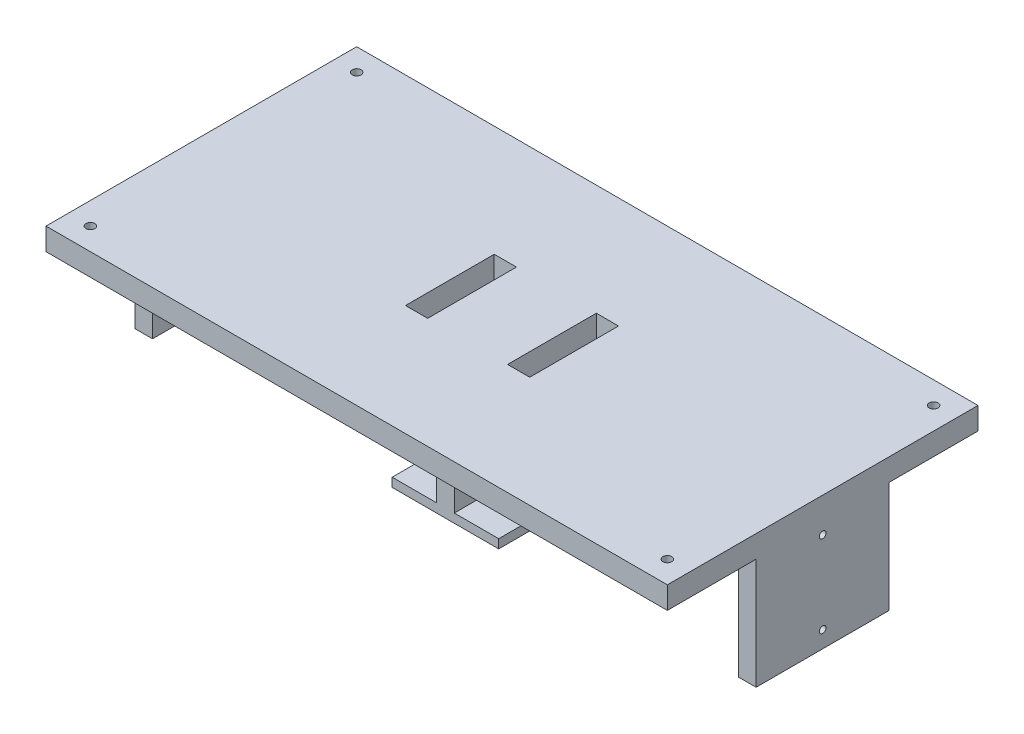
ISO-10303-21;
HEADER;
FILE_DESCRIPTION(('STEP AP214'),'2;1');
FILE_NAME('part.step','',(''),(''),'','','');
FILE_SCHEMA(('AUTOMOTIVE_DESIGN { 1 0 10303 214 1 1 1 1 }'));
ENDSEC;
DATA;
#1=APPLICATION_CONTEXT('core data for automotive mechanical design processes');
#2=APPLICATION_PROTOCOL_DEFINITION('international standard','automotive_design',2000,#1);
#3=PRODUCT_CONTEXT('',#1,'mechanical');
#4=PRODUCT('Part','Part','',(#3));
#5=PRODUCT_RELATED_PRODUCT_CATEGORY('part','',(#4));
#6=PRODUCT_DEFINITION_FORMATION('','',#4);
#7=PRODUCT_DEFINITION_CONTEXT('part definition',#1,'design');
#8=PRODUCT_DEFINITION('design','',#6,#7);
#9=PRODUCT_DEFINITION_SHAPE('','',#8);
#10=(LENGTH_UNIT() NAMED_UNIT(*) SI_UNIT(.MILLI.,.METRE.));
#11=(NAMED_UNIT(*) PLANE_ANGLE_UNIT() SI_UNIT($,.RADIAN.));
#12=(NAMED_UNIT(*) SI_UNIT($,.STERADIAN.) SOLID_ANGLE_UNIT());
#13=UNCERTAINTY_MEASURE_WITH_UNIT(LENGTH_MEASURE(1.E-05),#10,'distance_accuracy_value','');
#14=(GEOMETRIC_REPRESENTATION_CONTEXT(3) GLOBAL_UNCERTAINTY_ASSIGNED_CONTEXT((#13)) GLOBAL_UNIT_ASSIGNED_CONTEXT((#10,
#11,#12)) REPRESENTATION_CONTEXT('',''));
#15=CARTESIAN_POINT('',(0.,0.,0.));
#16=DIRECTION('',(0.,0.,1.));
#17=DIRECTION('',(1.,0.,0.));
#18=AXIS2_PLACEMENT_3D('',#15,#16,#17);
#19=CARTESIAN_POINT('',(0.,0.,0.));
#20=DIRECTION('',(0.,1.,0.));
#21=DIRECTION('',(0.,0.,1.));
#22=AXIS2_PLACEMENT_3D('',#19,#20,#21);
#23=PLANE('',#22);
#24=CARTESIAN_POINT('',(5.00000000000003,0.,65.));
#25=DIRECTION('',(0.,1.,0.));
#26=DIRECTION('',(0.,0.,1.));
#27=AXIS2_PLACEMENT_3D('',#24,#25,#26);
#28=CIRCLE('',#27,0.999999999999998);
#29=CARTESIAN_POINT('',(5.00000000000003,0.,66.));
#30=VERTEX_POINT('',#29);
#31=EDGE_CURVE('E287',#30,#30,#28,.T.);
#32=ORIENTED_EDGE('',*,*,#31,.T.);
#33=EDGE_LOOP('',(#32));
#34=FACE_BOUND('',#33,.T.);
#35=CARTESIAN_POINT('',(5.,0.,5.00000000000002));
#36=DIRECTION('',(0.,1.,0.));
#37=DIRECTION('',(0.,0.,1.));
#38=AXIS2_PLACEMENT_3D('',#35,#36,#37);
#39=CIRCLE('',#38,0.999999999999998);
#40=CARTESIAN_POINT('',(5.,0.,6.00000000000002));
#41=VERTEX_POINT('',#40);
#42=EDGE_CURVE('E925',#41,#41,#39,.T.);
#43=ORIENTED_EDGE('',*,*,#42,.T.);
#44=EDGE_LOOP('',(#43));
#45=FACE_BOUND('',#44,.T.);
#46=CARTESIAN_POINT('',(135.,0.,4.99999999999999));
#47=DIRECTION('',(0.,1.,0.));
#48=DIRECTION('',(0.,0.,1.));
#49=AXIS2_PLACEMENT_3D('',#46,#47,#48);
#50=CIRCLE('',#49,0.999999999999998);
#51=CARTESIAN_POINT('',(135.,0.,5.99999999999999));
#52=VERTEX_POINT('',#51);
#53=EDGE_CURVE('E929',#52,#52,#50,.T.);
#54=ORIENTED_EDGE('',*,*,#53,.T.);
#55=EDGE_LOOP('',(#54));
#56=FACE_BOUND('',#55,.T.);
#57=CARTESIAN_POINT('',(135.,0.,65.));
#58=DIRECTION('',(0.,1.,0.));
#59=DIRECTION('',(0.,0.,1.));
#60=AXIS2_PLACEMENT_3D('',#57,#58,#59);
#61=CIRCLE('',#60,0.999999999999998);
#62=CARTESIAN_POINT('',(135.,0.,66.));
#63=VERTEX_POINT('',#62);
#64=EDGE_CURVE('E972',#63,#63,#61,.T.);
#65=ORIENTED_EDGE('',*,*,#64,.T.);
#66=EDGE_LOOP('',(#65));
#67=FACE_BOUND('',#66,.T.);
#68=DIRECTION('',(1.,0.,0.));
#69=VECTOR('',#68,1.);
#70=CARTESIAN_POINT('',(0.,0.,45.));
#71=LINE('',#70,#69);
#72=CARTESIAN_POINT('',(79.,0.,45.));
#73=VERTEX_POINT('',#72);
#74=CARTESIAN_POINT('',(84.,0.,45.));
#75=VERTEX_POINT('',#74);
#76=EDGE_CURVE('E321',#73,#75,#71,.T.);
#77=ORIENTED_EDGE('',*,*,#76,.T.);
#78=DIRECTION('',(0.,0.,-1.));
#79=VECTOR('',#78,1.);
#80=CARTESIAN_POINT('',(84.,0.,0.));
#81=LINE('',#80,#79);
#82=CARTESIAN_POINT('',(84.,0.,25.));
#83=VERTEX_POINT('',#82);
#84=EDGE_CURVE('E325',#75,#83,#81,.T.);
#85=ORIENTED_EDGE('',*,*,#84,.T.);
#86=DIRECTION('',(-1.,0.,0.));
#87=VECTOR('',#86,1.);
#88=CARTESIAN_POINT('',(0.,0.,25.));
#89=LINE('',#88,#87);
#90=CARTESIAN_POINT('',(79.,0.,25.));
#91=VERTEX_POINT('',#90);
#92=EDGE_CURVE('E316',#83,#91,#89,.T.);
#93=ORIENTED_EDGE('',*,*,#92,.T.);
#94=DIRECTION('',(0.,0.,1.));
#95=VECTOR('',#94,1.);
#96=CARTESIAN_POINT('',(79.,0.,0.));
#97=LINE('',#96,#95);
#98=EDGE_CURVE('E240',#91,#73,#97,.T.);
#99=ORIENTED_EDGE('',*,*,#98,.T.);
#100=EDGE_LOOP('',(#77,#85,#93,#99));
#101=FACE_BOUND('',#100,.T.);
#102=DIRECTION('',(1.,0.,0.));
#103=VECTOR('',#102,1.);
#104=CARTESIAN_POINT('',(0.,0.,45.));
#105=LINE('',#104,#103);
#106=CARTESIAN_POINT('',(56.,0.,45.));
#107=VERTEX_POINT('',#106);
#108=CARTESIAN_POINT('',(61.,0.,45.));
#109=VERTEX_POINT('',#108);
#110=EDGE_CURVE('E308',#107,#109,#105,.T.);
#111=ORIENTED_EDGE('',*,*,#110,.T.);
#112=DIRECTION('',(0.,0.,-1.));
#113=VECTOR('',#112,1.);
#114=CARTESIAN_POINT('',(61.,0.,0.));
#115=LINE('',#114,#113);
#116=CARTESIAN_POINT('',(61.,0.,25.));
#117=VERTEX_POINT('',#116);
#118=EDGE_CURVE('E312',#109,#117,#115,.T.);
#119=ORIENTED_EDGE('',*,*,#118,.T.);
#120=DIRECTION('',(-1.,0.,0.));
#121=VECTOR('',#120,1.);
#122=CARTESIAN_POINT('',(0.,0.,25.));
#123=LINE('',#122,#121);
#124=CARTESIAN_POINT('',(56.,0.,25.));
#125=VERTEX_POINT('',#124);
#126=EDGE_CURVE('E269',#117,#125,#123,.T.);
#127=ORIENTED_EDGE('',*,*,#126,.T.);
#128=DIRECTION('',(0.,0.,1.));
#129=VECTOR('',#128,1.);
#130=CARTESIAN_POINT('',(56.,0.,0.));
#131=LINE('',#130,#129);
#132=EDGE_CURVE('E304',#125,#107,#131,.T.);
#133=ORIENTED_EDGE('',*,*,#132,.T.);
#134=EDGE_LOOP('',(#111,#119,#127,#133));
#135=FACE_BOUND('',#134,.T.);
#136=DIRECTION('',(0.,0.,1.));
#137=VECTOR('',#136,1.);
#138=CARTESIAN_POINT('',(72.,0.,20.));
#139=LINE('',#138,#137);
#140=CARTESIAN_POINT('',(72.,0.,20.));
#141=VERTEX_POINT('',#140);
#142=CARTESIAN_POINT('',(72.,0.,50.));
#143=VERTEX_POINT('',#142);
#144=EDGE_CURVE('E489',#141,#143,#139,.T.);
#145=ORIENTED_EDGE('',*,*,#144,.F.);
#146=DIRECTION('',(-1.,0.,0.));
#147=VECTOR('',#146,1.);
#148=CARTESIAN_POINT('',(72.,0.,20.));
#149=LINE('',#148,#147);
#150=CARTESIAN_POINT('',(68.,0.,20.));
#151=VERTEX_POINT('',#150);
#152=EDGE_CURVE('E439',#141,#151,#149,.T.);
#153=ORIENTED_EDGE('',*,*,#152,.T.);
#154=DIRECTION('',(0.,0.,1.));
#155=VECTOR('',#154,1.);
#156=CARTESIAN_POINT('',(68.,0.,20.));
#157=LINE('',#156,#155);
#158=CARTESIAN_POINT('',(68.,0.,50.));
#159=VERTEX_POINT('',#158);
#160=EDGE_CURVE('E496',#151,#159,#157,.T.);
#161=ORIENTED_EDGE('',*,*,#160,.T.);
#162=DIRECTION('',(-1.,0.,0.));
#163=VECTOR('',#162,1.);
#164=CARTESIAN_POINT('',(72.,0.,50.));
#165=LINE('',#164,#163);
#166=EDGE_CURVE('E492',#143,#159,#165,.T.);
#167=ORIENTED_EDGE('',*,*,#166,.F.);
#168=EDGE_LOOP('',(#145,#153,#161,#167));
#169=FACE_BOUND('',#168,.T.);
#170=DIRECTION('',(1.,0.,0.));
#171=VECTOR('',#170,1.);
#172=CARTESIAN_POINT('',(0.,0.,20.));
#173=LINE('',#172,#171);
#174=CARTESIAN_POINT('',(0.,0.,20.));
#175=VERTEX_POINT('',#174);
#176=CARTESIAN_POINT('',(4.,0.,20.));
#177=VERTEX_POINT('',#176);
#178=EDGE_CURVE('E398',#175,#177,#173,.T.);
#179=ORIENTED_EDGE('',*,*,#178,.F.);
#180=DIRECTION('',(0.,0.,1.));
#181=VECTOR('',#180,1.);
#182=CARTESIAN_POINT('',(0.,0.,0.));
#183=LINE('',#182,#181);
#184=CARTESIAN_POINT('',(0.,0.,0.));
#185=VERTEX_POINT('',#184);
#186=EDGE_CURVE('E523',#185,#175,#183,.T.);
#187=ORIENTED_EDGE('',*,*,#186,.F.);
#188=DIRECTION('',(-1.,0.,0.));
#189=VECTOR('',#188,1.);
#190=CARTESIAN_POINT('',(0.,0.,0.));
#191=LINE('',#190,#189);
#192=CARTESIAN_POINT('',(140.,0.,0.));
#193=VERTEX_POINT('',#192);
#194=EDGE_CURVE('E513',#193,#185,#191,.T.);
#195=ORIENTED_EDGE('',*,*,#194,.F.);
#196=DIRECTION('',(0.,0.,-1.));
#197=VECTOR('',#196,1.);
#198=CARTESIAN_POINT('',(140.,0.,0.));
#199=LINE('',#198,#197);
#200=CARTESIAN_POINT('',(140.,0.,20.));
#201=VERTEX_POINT('',#200);
#202=EDGE_CURVE('E530',#201,#193,#199,.T.);
#203=ORIENTED_EDGE('',*,*,#202,.F.);
#204=DIRECTION('',(-1.,0.,0.));
#205=VECTOR('',#204,1.);
#206=CARTESIAN_POINT('',(0.,0.,20.));
#207=LINE('',#206,#205);
#208=CARTESIAN_POINT('',(136.,0.,20.));
#209=VERTEX_POINT('',#208);
#210=EDGE_CURVE('E452',#201,#209,#207,.T.);
#211=ORIENTED_EDGE('',*,*,#210,.T.);
#212=DIRECTION('',(0.,0.,-1.));
#213=VECTOR('',#212,1.);
#214=CARTESIAN_POINT('',(136.,0.,-1.25825276124184E-13));
#215=LINE('',#214,#213);
#216=CARTESIAN_POINT('',(136.,0.,50.));
#217=VERTEX_POINT('',#216);
#218=EDGE_CURVE('E455',#217,#209,#215,.T.);
#219=ORIENTED_EDGE('',*,*,#218,.F.);
#220=DIRECTION('',(-1.,0.,0.));
#221=VECTOR('',#220,1.);
#222=CARTESIAN_POINT('',(0.,0.,50.));
#223=LINE('',#222,#221);
#224=CARTESIAN_POINT('',(140.,0.,50.));
#225=VERTEX_POINT('',#224);
#226=EDGE_CURVE('E414',#225,#217,#223,.T.);
#227=ORIENTED_EDGE('',*,*,#226,.F.);
#228=CARTESIAN_POINT('',(140.,0.,70.));
#229=VERTEX_POINT('',#228);
#230=EDGE_CURVE('E531',#229,#225,#199,.T.);
#231=ORIENTED_EDGE('',*,*,#230,.F.);
#232=DIRECTION('',(1.,0.,0.));
#233=VECTOR('',#232,1.);
#234=CARTESIAN_POINT('',(0.,0.,70.));
#235=LINE('',#234,#233);
#236=CARTESIAN_POINT('',(0.,0.,70.));
#237=VERTEX_POINT('',#236);
#238=EDGE_CURVE('E527',#237,#229,#235,.T.);
#239=ORIENTED_EDGE('',*,*,#238,.F.);
#240=CARTESIAN_POINT('',(0.,0.,50.));
#241=VERTEX_POINT('',#240);
#242=EDGE_CURVE('E433',#241,#237,#183,.T.);
#243=ORIENTED_EDGE('',*,*,#242,.F.);
#244=DIRECTION('',(1.,0.,0.));
#245=VECTOR('',#244,1.);
#246=CARTESIAN_POINT('',(0.,0.,50.));
#247=LINE('',#246,#245);
#248=CARTESIAN_POINT('',(4.,0.,50.));
#249=VERTEX_POINT('',#248);
#250=EDGE_CURVE('E413',#241,#249,#247,.T.);
#251=ORIENTED_EDGE('',*,*,#250,.T.);
#252=DIRECTION('',(0.,0.,-1.));
#253=VECTOR('',#252,1.);
#254=CARTESIAN_POINT('',(4.,0.,0.));
#255=LINE('',#254,#253);
#256=EDGE_CURVE('E409',#249,#177,#255,.T.);
#257=ORIENTED_EDGE('',*,*,#256,.T.);
#258=EDGE_LOOP('',(#179,#187,#195,#203,#211,#219,#227,#231,#239,#243,#251,#257));
#259=FACE_BOUND('',#258,.T.);
#260=ADVANCED_FACE('F47',(#34,#45,#56,#67,#101,#135,#169,#259),#23,.F.);
#261=CARTESIAN_POINT('',(0.,5.,0.));
#262=DIRECTION('',(1.,0.,0.));
#263=DIRECTION('',(0.,0.,-1.));
#264=AXIS2_PLACEMENT_3D('',#261,#262,#263);
#265=PLANE('',#264);
#266=CARTESIAN_POINT('',(0.,-2.75,35.));
#267=DIRECTION('',(-1.,0.,0.));
#268=DIRECTION('',(0.,0.,1.));
#269=AXIS2_PLACEMENT_3D('',#266,#267,#268);
#270=CIRCLE('',#269,0.749999999999999);
#271=CARTESIAN_POINT('',(0.,-2.75,35.75));
#272=VERTEX_POINT('',#271);
#273=EDGE_CURVE('E338',#272,#272,#270,.T.);
#274=ORIENTED_EDGE('',*,*,#273,.F.);
#275=EDGE_LOOP('',(#274));
#276=FACE_BOUND('',#275,.T.);
#277=CARTESIAN_POINT('',(0.,-21.25,35.));
#278=DIRECTION('',(-1.,0.,0.));
#279=DIRECTION('',(0.,0.,1.));
#280=AXIS2_PLACEMENT_3D('',#277,#278,#279);
#281=CIRCLE('',#280,0.749999999999999);
#282=CARTESIAN_POINT('',(0.,-21.25,35.75));
#283=VERTEX_POINT('',#282);
#284=EDGE_CURVE('E343',#283,#283,#281,.T.);
#285=ORIENTED_EDGE('',*,*,#284,.F.);
#286=EDGE_LOOP('',(#285));
#287=FACE_BOUND('',#286,.T.);
#288=ORIENTED_EDGE('',*,*,#186,.T.);
#289=DIRECTION('',(0.,1.,0.));
#290=VECTOR('',#289,1.);
#291=CARTESIAN_POINT('',(0.,-25.,20.));
#292=LINE('',#291,#290);
#293=CARTESIAN_POINT('',(0.,-25.,20.));
#294=VERTEX_POINT('',#293);
#295=EDGE_CURVE('E423',#294,#175,#292,.T.);
#296=ORIENTED_EDGE('',*,*,#295,.F.);
#297=DIRECTION('',(0.,0.,-1.));
#298=VECTOR('',#297,1.);
#299=CARTESIAN_POINT('',(0.,-25.,0.));
#300=LINE('',#299,#298);
#301=CARTESIAN_POINT('',(0.,-25.,50.));
#302=VERTEX_POINT('',#301);
#303=EDGE_CURVE('E402',#302,#294,#300,.T.);
#304=ORIENTED_EDGE('',*,*,#303,.F.);
#305=DIRECTION('',(0.,1.,0.));
#306=VECTOR('',#305,1.);
#307=CARTESIAN_POINT('',(0.,-25.,50.));
#308=LINE('',#307,#306);
#309=EDGE_CURVE('E426',#302,#241,#308,.T.);
#310=ORIENTED_EDGE('',*,*,#309,.T.);
#311=ORIENTED_EDGE('',*,*,#242,.T.);
#312=DIRECTION('',(0.,-1.,0.));
#313=VECTOR('',#312,1.);
#314=CARTESIAN_POINT('',(0.,5.,70.));
#315=LINE('',#314,#313);
#316=CARTESIAN_POINT('',(0.,5.,70.));
#317=VERTEX_POINT('',#316);
#318=EDGE_CURVE('E11',#317,#237,#315,.T.);
#319=ORIENTED_EDGE('',*,*,#318,.F.);
#320=DIRECTION('',(0.,0.,1.));
#321=VECTOR('',#320,1.);
#322=CARTESIAN_POINT('',(0.,5.,0.));
#323=LINE('',#322,#321);
#324=CARTESIAN_POINT('',(0.,5.,0.));
#325=VERTEX_POINT('',#324);
#326=EDGE_CURVE('E508',#325,#317,#323,.T.);
#327=ORIENTED_EDGE('',*,*,#326,.F.);
#328=DIRECTION('',(0.,-1.,0.));
#329=VECTOR('',#328,1.);
#330=CARTESIAN_POINT('',(0.,5.,0.));
#331=LINE('',#330,#329);
#332=EDGE_CURVE('E522',#325,#185,#331,.T.);
#333=ORIENTED_EDGE('',*,*,#332,.T.);
#334=EDGE_LOOP('',(#288,#296,#304,#310,#311,#319,#327,#333));
#335=FACE_BOUND('',#334,.T.);
#336=ADVANCED_FACE('F49',(#276,#287,#335),#265,.F.);
#337=CARTESIAN_POINT('',(0.,5.,70.));
#338=DIRECTION('',(0.,0.,-1.));
#339=DIRECTION('',(-1.,0.,0.));
#340=AXIS2_PLACEMENT_3D('',#337,#338,#339);
#341=PLANE('',#340);
#342=ORIENTED_EDGE('',*,*,#238,.T.);
#343=DIRECTION('',(0.,-1.,0.));
#344=VECTOR('',#343,1.);
#345=CARTESIAN_POINT('',(140.,5.,70.));
#346=LINE('',#345,#344);
#347=CARTESIAN_POINT('',(140.,5.,70.));
#348=VERTEX_POINT('',#347);
#349=EDGE_CURVE('E57',#348,#229,#346,.T.);
#350=ORIENTED_EDGE('',*,*,#349,.F.);
#351=DIRECTION('',(1.,0.,0.));
#352=VECTOR('',#351,1.);
#353=CARTESIAN_POINT('',(0.,5.,70.));
#354=LINE('',#353,#352);
#355=EDGE_CURVE('E512',#317,#348,#354,.T.);
#356=ORIENTED_EDGE('',*,*,#355,.F.);
#357=ORIENTED_EDGE('',*,*,#318,.T.);
#358=EDGE_LOOP('',(#342,#350,#356,#357));
#359=FACE_BOUND('',#358,.T.);
#360=ADVANCED_FACE('F588',(#359),#341,.F.);
#361=CARTESIAN_POINT('',(140.,5.,0.));
#362=DIRECTION('',(-1.,0.,0.));
#363=DIRECTION('',(0.,0.,1.));
#364=AXIS2_PLACEMENT_3D('',#361,#362,#363);
#365=PLANE('',#364);
#366=CARTESIAN_POINT('',(140.,-21.25,35.));
#367=DIRECTION('',(1.,0.,0.));
#368=DIRECTION('',(0.,0.,-1.));
#369=AXIS2_PLACEMENT_3D('',#366,#367,#368);
#370=CIRCLE('',#369,0.749999999999999);
#371=CARTESIAN_POINT('',(140.,-21.25,34.25));
#372=VERTEX_POINT('',#371);
#373=EDGE_CURVE('E330',#372,#372,#370,.T.);
#374=ORIENTED_EDGE('',*,*,#373,.F.);
#375=EDGE_LOOP('',(#374));
#376=FACE_BOUND('',#375,.T.);
#377=CARTESIAN_POINT('',(140.,-2.75,35.));
#378=DIRECTION('',(1.,0.,0.));
#379=DIRECTION('',(0.,0.,-1.));
#380=AXIS2_PLACEMENT_3D('',#377,#378,#379);
#381=CIRCLE('',#380,0.749999999999999);
#382=CARTESIAN_POINT('',(140.,-2.75,34.25));
#383=VERTEX_POINT('',#382);
#384=EDGE_CURVE('E329',#383,#383,#381,.T.);
#385=ORIENTED_EDGE('',*,*,#384,.F.);
#386=EDGE_LOOP('',(#385));
#387=FACE_BOUND('',#386,.T.);
#388=ORIENTED_EDGE('',*,*,#230,.T.);
#389=DIRECTION('',(0.,1.,0.));
#390=VECTOR('',#389,1.);
#391=CARTESIAN_POINT('',(140.,-25.,50.));
#392=LINE('',#391,#390);
#393=CARTESIAN_POINT('',(140.,-25.,50.));
#394=VERTEX_POINT('',#393);
#395=EDGE_CURVE('E434',#394,#225,#392,.T.);
#396=ORIENTED_EDGE('',*,*,#395,.F.);
#397=DIRECTION('',(0.,0.,1.));
#398=VECTOR('',#397,1.);
#399=CARTESIAN_POINT('',(140.,-25.,0.));
#400=LINE('',#399,#398);
#401=CARTESIAN_POINT('',(140.,-25.,20.));
#402=VERTEX_POINT('',#401);
#403=EDGE_CURVE('E456',#402,#394,#400,.T.);
#404=ORIENTED_EDGE('',*,*,#403,.F.);
#405=DIRECTION('',(0.,1.,0.));
#406=VECTOR('',#405,1.);
#407=CARTESIAN_POINT('',(140.,-25.,20.));
#408=LINE('',#407,#406);
#409=EDGE_CURVE('E447',#402,#201,#408,.T.);
#410=ORIENTED_EDGE('',*,*,#409,.T.);
#411=ORIENTED_EDGE('',*,*,#202,.T.);
#412=DIRECTION('',(0.,-1.,0.));
#413=VECTOR('',#412,1.);
#414=CARTESIAN_POINT('',(140.,5.,0.));
#415=LINE('',#414,#413);
#416=CARTESIAN_POINT('',(140.,5.,0.));
#417=VERTEX_POINT('',#416);
#418=EDGE_CURVE('E540',#417,#193,#415,.T.);
#419=ORIENTED_EDGE('',*,*,#418,.F.);
#420=DIRECTION('',(0.,0.,-1.));
#421=VECTOR('',#420,1.);
#422=CARTESIAN_POINT('',(140.,5.,0.));
#423=LINE('',#422,#421);
#424=EDGE_CURVE('E516',#348,#417,#423,.T.);
#425=ORIENTED_EDGE('',*,*,#424,.F.);
#426=ORIENTED_EDGE('',*,*,#349,.T.);
#427=EDGE_LOOP('',(#388,#396,#404,#410,#411,#419,#425,#426));
#428=FACE_BOUND('',#427,.T.);
#429=ADVANCED_FACE('F598',(#376,#387,#428),#365,.F.);
#430=CARTESIAN_POINT('',(0.,5.,0.));
#431=DIRECTION('',(0.,0.,1.));
#432=DIRECTION('',(1.,0.,0.));
#433=AXIS2_PLACEMENT_3D('',#430,#431,#432);
#434=PLANE('',#433);
#435=ORIENTED_EDGE('',*,*,#194,.T.);
#436=ORIENTED_EDGE('',*,*,#332,.F.);
#437=DIRECTION('',(-1.,0.,0.));
#438=VECTOR('',#437,1.);
#439=CARTESIAN_POINT('',(0.,5.,0.));
#440=LINE('',#439,#438);
#441=EDGE_CURVE('E519',#417,#325,#440,.T.);
#442=ORIENTED_EDGE('',*,*,#441,.F.);
#443=ORIENTED_EDGE('',*,*,#418,.T.);
#444=EDGE_LOOP('',(#435,#436,#442,#443));
#445=FACE_BOUND('',#444,.T.);
#446=ADVANCED_FACE('F595',(#445),#434,.F.);
#447=CARTESIAN_POINT('',(0.,5.,0.));
#448=DIRECTION('',(0.,1.,0.));
#449=DIRECTION('',(0.,0.,1.));
#450=AXIS2_PLACEMENT_3D('',#447,#448,#449);
#451=PLANE('',#450);
#452=CARTESIAN_POINT('',(5.00000000000003,5.,65.));
#453=DIRECTION('',(0.,1.,0.));
#454=DIRECTION('',(0.,0.,-1.));
#455=AXIS2_PLACEMENT_3D('',#452,#453,#454);
#456=CIRCLE('',#455,0.999999999999998);
#457=CARTESIAN_POINT('',(5.00000000000003,5.,64.));
#458=VERTEX_POINT('',#457);
#459=EDGE_CURVE('E922',#458,#458,#456,.T.);
#460=ORIENTED_EDGE('',*,*,#459,.F.);
#461=EDGE_LOOP('',(#460));
#462=FACE_BOUND('',#461,.T.);
#463=CARTESIAN_POINT('',(5.,5.,5.00000000000002));
#464=DIRECTION('',(0.,1.,0.));
#465=DIRECTION('',(0.,0.,1.));
#466=AXIS2_PLACEMENT_3D('',#463,#464,#465);
#467=CIRCLE('',#466,0.999999999999998);
#468=CARTESIAN_POINT('',(5.,5.,6.00000000000002));
#469=VERTEX_POINT('',#468);
#470=EDGE_CURVE('E963',#469,#469,#467,.T.);
#471=ORIENTED_EDGE('',*,*,#470,.F.);
#472=EDGE_LOOP('',(#471));
#473=FACE_BOUND('',#472,.T.);
#474=CARTESIAN_POINT('',(135.,5.,4.99999999999999));
#475=DIRECTION('',(0.,1.,0.));
#476=DIRECTION('',(0.,0.,-1.));
#477=AXIS2_PLACEMENT_3D('',#474,#475,#476);
#478=CIRCLE('',#477,0.999999999999998);
#479=CARTESIAN_POINT('',(135.,5.,3.99999999999999));
#480=VERTEX_POINT('',#479);
#481=EDGE_CURVE('E967',#480,#480,#478,.T.);
#482=ORIENTED_EDGE('',*,*,#481,.F.);
#483=EDGE_LOOP('',(#482));
#484=FACE_BOUND('',#483,.T.);
#485=CARTESIAN_POINT('',(135.,5.,65.));
#486=DIRECTION('',(0.,1.,0.));
#487=DIRECTION('',(0.,0.,1.));
#488=AXIS2_PLACEMENT_3D('',#485,#486,#487);
#489=CIRCLE('',#488,0.999999999999998);
#490=CARTESIAN_POINT('',(135.,5.,66.));
#491=VERTEX_POINT('',#490);
#492=EDGE_CURVE('E970',#491,#491,#489,.T.);
#493=ORIENTED_EDGE('',*,*,#492,.F.);
#494=EDGE_LOOP('',(#493));
#495=FACE_BOUND('',#494,.T.);
#496=DIRECTION('',(0.,0.,-1.));
#497=VECTOR('',#496,1.);
#498=CARTESIAN_POINT('',(84.,5.,45.));
#499=LINE('',#498,#497);
#500=CARTESIAN_POINT('',(84.,5.,45.));
#501=VERTEX_POINT('',#500);
#502=CARTESIAN_POINT('',(84.,5.,25.));
#503=VERTEX_POINT('',#502);
#504=EDGE_CURVE('E254',#501,#503,#499,.T.);
#505=ORIENTED_EDGE('',*,*,#504,.F.);
#506=DIRECTION('',(1.,0.,0.));
#507=VECTOR('',#506,1.);
#508=CARTESIAN_POINT('',(79.,5.,45.));
#509=LINE('',#508,#507);
#510=CARTESIAN_POINT('',(79.,5.,45.));
#511=VERTEX_POINT('',#510);
#512=EDGE_CURVE('E259',#511,#501,#509,.T.);
#513=ORIENTED_EDGE('',*,*,#512,.F.);
#514=DIRECTION('',(0.,0.,1.));
#515=VECTOR('',#514,1.);
#516=CARTESIAN_POINT('',(79.,5.,45.));
#517=LINE('',#516,#515);
#518=CARTESIAN_POINT('',(79.,5.,25.));
#519=VERTEX_POINT('',#518);
#520=EDGE_CURVE('E237',#519,#511,#517,.T.);
#521=ORIENTED_EDGE('',*,*,#520,.F.);
#522=DIRECTION('',(-1.,0.,0.));
#523=VECTOR('',#522,1.);
#524=CARTESIAN_POINT('',(79.,5.,25.));
#525=LINE('',#524,#523);
#526=EDGE_CURVE('E248',#503,#519,#525,.T.);
#527=ORIENTED_EDGE('',*,*,#526,.F.);
#528=EDGE_LOOP('',(#505,#513,#521,#527));
#529=FACE_BOUND('',#528,.T.);
#530=DIRECTION('',(0.,0.,-1.));
#531=VECTOR('',#530,1.);
#532=CARTESIAN_POINT('',(61.,5.,45.));
#533=LINE('',#532,#531);
#534=CARTESIAN_POINT('',(61.,5.,45.));
#535=VERTEX_POINT('',#534);
#536=CARTESIAN_POINT('',(61.,5.,25.));
#537=VERTEX_POINT('',#536);
#538=EDGE_CURVE('E298',#535,#537,#533,.T.);
#539=ORIENTED_EDGE('',*,*,#538,.F.);
#540=DIRECTION('',(1.,0.,0.));
#541=VECTOR('',#540,1.);
#542=CARTESIAN_POINT('',(61.,5.,45.));
#543=LINE('',#542,#541);
#544=CARTESIAN_POINT('',(56.,5.,45.));
#545=VERTEX_POINT('',#544);
#546=EDGE_CURVE('E278',#545,#535,#543,.T.);
#547=ORIENTED_EDGE('',*,*,#546,.F.);
#548=DIRECTION('',(0.,0.,1.));
#549=VECTOR('',#548,1.);
#550=CARTESIAN_POINT('',(56.,5.,45.));
#551=LINE('',#550,#549);
#552=CARTESIAN_POINT('',(56.,5.,25.));
#553=VERTEX_POINT('',#552);
#554=EDGE_CURVE('E291',#553,#545,#551,.T.);
#555=ORIENTED_EDGE('',*,*,#554,.F.);
#556=DIRECTION('',(-1.,0.,0.));
#557=VECTOR('',#556,1.);
#558=CARTESIAN_POINT('',(61.,5.,25.));
#559=LINE('',#558,#557);
#560=EDGE_CURVE('E295',#537,#553,#559,.T.);
#561=ORIENTED_EDGE('',*,*,#560,.F.);
#562=EDGE_LOOP('',(#539,#547,#555,#561));
#563=FACE_BOUND('',#562,.T.);
#564=ORIENTED_EDGE('',*,*,#326,.T.);
#565=ORIENTED_EDGE('',*,*,#355,.T.);
#566=ORIENTED_EDGE('',*,*,#424,.T.);
#567=ORIENTED_EDGE('',*,*,#441,.T.);
#568=EDGE_LOOP('',(#564,#565,#566,#567));
#569=FACE_BOUND('',#568,.T.);
#570=ADVANCED_FACE('F256',(#462,#473,#484,#495,#529,#563,#569),#451,.T.);
#571=CARTESIAN_POINT('',(72.,-25.,20.));
#572=DIRECTION('',(0.,0.,-1.));
#573=DIRECTION('',(-1.,0.,0.));
#574=AXIS2_PLACEMENT_3D('',#571,#572,#573);
#575=PLANE('',#574);
#576=ORIENTED_EDGE('',*,*,#152,.F.);
#577=DIRECTION('',(0.,1.,0.));
#578=VECTOR('',#577,1.);
#579=CARTESIAN_POINT('',(72.,-25.,20.));
#580=LINE('',#579,#578);
#581=CARTESIAN_POINT('',(72.,-25.,20.));
#582=VERTEX_POINT('',#581);
#583=EDGE_CURVE('E392',#582,#141,#580,.T.);
#584=ORIENTED_EDGE('',*,*,#583,.F.);
#585=DIRECTION('',(1.,0.,0.));
#586=VECTOR('',#585,1.);
#587=CARTESIAN_POINT('',(0.,-25.,20.));
#588=LINE('',#587,#586);
#589=CARTESIAN_POINT('',(82.,-25.,20.));
#590=VERTEX_POINT('',#589);
#591=EDGE_CURVE('E371',#582,#590,#588,.T.);
#592=ORIENTED_EDGE('',*,*,#591,.T.);
#593=DIRECTION('',(0.,1.,0.));
#594=VECTOR('',#593,1.);
#595=CARTESIAN_POINT('',(82.,-27.,20.));
#596=LINE('',#595,#594);
#597=CARTESIAN_POINT('',(82.,-27.,20.));
#598=VERTEX_POINT('',#597);
#599=EDGE_CURVE('E382',#598,#590,#596,.T.);
#600=ORIENTED_EDGE('',*,*,#599,.F.);
#601=DIRECTION('',(1.,0.,0.));
#602=VECTOR('',#601,1.);
#603=CARTESIAN_POINT('',(0.,-27.,20.));
#604=LINE('',#603,#602);
#605=CARTESIAN_POINT('',(58.,-27.,20.));
#606=VERTEX_POINT('',#605);
#607=EDGE_CURVE('E356',#606,#598,#604,.T.);
#608=ORIENTED_EDGE('',*,*,#607,.F.);
#609=DIRECTION('',(0.,1.,0.));
#610=VECTOR('',#609,1.);
#611=CARTESIAN_POINT('',(58.,-27.,20.));
#612=LINE('',#611,#610);
#613=CARTESIAN_POINT('',(58.,-25.,20.));
#614=VERTEX_POINT('',#613);
#615=EDGE_CURVE('E386',#606,#614,#612,.T.);
#616=ORIENTED_EDGE('',*,*,#615,.T.);
#617=CARTESIAN_POINT('',(68.,-25.,20.));
#618=VERTEX_POINT('',#617);
#619=EDGE_CURVE('E372',#614,#618,#588,.T.);
#620=ORIENTED_EDGE('',*,*,#619,.T.);
#621=DIRECTION('',(0.,1.,0.));
#622=VECTOR('',#621,1.);
#623=CARTESIAN_POINT('',(68.,-25.,20.));
#624=LINE('',#623,#622);
#625=EDGE_CURVE('E475',#618,#151,#624,.T.);
#626=ORIENTED_EDGE('',*,*,#625,.T.);
#627=EDGE_LOOP('',(#576,#584,#592,#600,#608,#616,#620,#626));
#628=FACE_BOUND('',#627,.T.);
#629=ADVANCED_FACE('F653',(#628),#575,.T.);
#630=CARTESIAN_POINT('',(72.,-25.,20.));
#631=DIRECTION('',(-1.,0.,0.));
#632=DIRECTION('',(0.,0.,1.));
#633=AXIS2_PLACEMENT_3D('',#630,#631,#632);
#634=PLANE('',#633);
#635=ORIENTED_EDGE('',*,*,#144,.T.);
#636=DIRECTION('',(0.,1.,0.));
#637=VECTOR('',#636,1.);
#638=CARTESIAN_POINT('',(72.,-25.,50.));
#639=LINE('',#638,#637);
#640=CARTESIAN_POINT('',(72.,-25.,50.));
#641=VERTEX_POINT('',#640);
#642=EDGE_CURVE('E483',#641,#143,#639,.T.);
#643=ORIENTED_EDGE('',*,*,#642,.F.);
#644=DIRECTION('',(0.,0.,1.));
#645=VECTOR('',#644,1.);
#646=CARTESIAN_POINT('',(72.,-25.,20.));
#647=LINE('',#646,#645);
#648=EDGE_CURVE('E478',#582,#641,#647,.T.);
#649=ORIENTED_EDGE('',*,*,#648,.F.);
#650=ORIENTED_EDGE('',*,*,#583,.T.);
#651=EDGE_LOOP('',(#635,#643,#649,#650));
#652=FACE_BOUND('',#651,.T.);
#653=ADVANCED_FACE('F658',(#652),#634,.F.);
#654=CARTESIAN_POINT('',(72.,-25.,50.));
#655=DIRECTION('',(0.,0.,-1.));
#656=DIRECTION('',(-1.,0.,0.));
#657=AXIS2_PLACEMENT_3D('',#654,#655,#656);
#658=PLANE('',#657);
#659=ORIENTED_EDGE('',*,*,#166,.T.);
#660=DIRECTION('',(0.,1.,0.));
#661=VECTOR('',#660,1.);
#662=CARTESIAN_POINT('',(68.,-25.,50.));
#663=LINE('',#662,#661);
#664=CARTESIAN_POINT('',(68.,-25.,50.));
#665=VERTEX_POINT('',#664);
#666=EDGE_CURVE('E479',#665,#159,#663,.T.);
#667=ORIENTED_EDGE('',*,*,#666,.F.);
#668=DIRECTION('',(1.,0.,0.));
#669=VECTOR('',#668,1.);
#670=CARTESIAN_POINT('',(0.,-25.,50.));
#671=LINE('',#670,#669);
#672=CARTESIAN_POINT('',(58.,-25.,50.));
#673=VERTEX_POINT('',#672);
#674=EDGE_CURVE('E363',#673,#665,#671,.T.);
#675=ORIENTED_EDGE('',*,*,#674,.F.);
#676=DIRECTION('',(0.,1.,0.));
#677=VECTOR('',#676,1.);
#678=CARTESIAN_POINT('',(58.,-27.,50.));
#679=LINE('',#678,#677);
#680=CARTESIAN_POINT('',(58.,-27.,50.));
#681=VERTEX_POINT('',#680);
#682=EDGE_CURVE('E389',#681,#673,#679,.T.);
#683=ORIENTED_EDGE('',*,*,#682,.F.);
#684=DIRECTION('',(1.,0.,0.));
#685=VECTOR('',#684,1.);
#686=CARTESIAN_POINT('',(0.,-27.,50.));
#687=LINE('',#686,#685);
#688=CARTESIAN_POINT('',(82.,-27.,50.));
#689=VERTEX_POINT('',#688);
#690=EDGE_CURVE('E347',#681,#689,#687,.T.);
#691=ORIENTED_EDGE('',*,*,#690,.T.);
#692=DIRECTION('',(0.,1.,0.));
#693=VECTOR('',#692,1.);
#694=CARTESIAN_POINT('',(82.,-27.,50.));
#695=LINE('',#694,#693);
#696=CARTESIAN_POINT('',(82.,-25.,50.));
#697=VERTEX_POINT('',#696);
#698=EDGE_CURVE('E362',#689,#697,#695,.T.);
#699=ORIENTED_EDGE('',*,*,#698,.T.);
#700=EDGE_CURVE('E367',#641,#697,#671,.T.);
#701=ORIENTED_EDGE('',*,*,#700,.F.);
#702=ORIENTED_EDGE('',*,*,#642,.T.);
#703=EDGE_LOOP('',(#659,#667,#675,#683,#691,#699,#701,#702));
#704=FACE_BOUND('',#703,.T.);
#705=ADVANCED_FACE('F644',(#704),#658,.F.);
#706=CARTESIAN_POINT('',(68.,-25.,20.));
#707=DIRECTION('',(-1.,0.,0.));
#708=DIRECTION('',(0.,0.,1.));
#709=AXIS2_PLACEMENT_3D('',#706,#707,#708);
#710=PLANE('',#709);
#711=ORIENTED_EDGE('',*,*,#160,.F.);
#712=ORIENTED_EDGE('',*,*,#625,.F.);
#713=DIRECTION('',(0.,0.,1.));
#714=VECTOR('',#713,1.);
#715=CARTESIAN_POINT('',(68.,-25.,20.));
#716=LINE('',#715,#714);
#717=EDGE_CURVE('E493',#618,#665,#716,.T.);
#718=ORIENTED_EDGE('',*,*,#717,.T.);
#719=ORIENTED_EDGE('',*,*,#666,.T.);
#720=EDGE_LOOP('',(#711,#712,#718,#719));
#721=FACE_BOUND('',#720,.T.);
#722=ADVANCED_FACE('F665',(#721),#710,.T.);
#723=CARTESIAN_POINT('',(0.,-25.,50.));
#724=DIRECTION('',(0.,0.,-1.));
#725=DIRECTION('',(-1.,0.,0.));
#726=AXIS2_PLACEMENT_3D('',#723,#724,#725);
#727=PLANE('',#726);
#728=ORIENTED_EDGE('',*,*,#226,.T.);
#729=DIRECTION('',(0.,1.,0.));
#730=VECTOR('',#729,1.);
#731=CARTESIAN_POINT('',(136.,-25.,50.));
#732=LINE('',#731,#730);
#733=CARTESIAN_POINT('',(136.,-25.,50.));
#734=VERTEX_POINT('',#733);
#735=EDGE_CURVE('E438',#734,#217,#732,.T.);
#736=ORIENTED_EDGE('',*,*,#735,.F.);
#737=DIRECTION('',(-1.,0.,0.));
#738=VECTOR('',#737,1.);
#739=CARTESIAN_POINT('',(0.,-25.,50.));
#740=LINE('',#739,#738);
#741=EDGE_CURVE('E469',#394,#734,#740,.T.);
#742=ORIENTED_EDGE('',*,*,#741,.F.);
#743=ORIENTED_EDGE('',*,*,#395,.T.);
#744=EDGE_LOOP('',(#728,#736,#742,#743));
#745=FACE_BOUND('',#744,.T.);
#746=ADVANCED_FACE('F619',(#745),#727,.F.);
#747=CARTESIAN_POINT('',(136.,-25.,-1.25825276124184E-13));
#748=DIRECTION('',(1.,0.,0.));
#749=DIRECTION('',(0.,0.,-1.));
#750=AXIS2_PLACEMENT_3D('',#747,#748,#749);
#751=PLANE('',#750);
#752=CARTESIAN_POINT('',(136.,-21.25,35.));
#753=DIRECTION('',(1.,0.,0.));
#754=DIRECTION('',(0.,0.,-1.));
#755=AXIS2_PLACEMENT_3D('',#752,#753,#754);
#756=CIRCLE('',#755,0.749999999999999);
#757=CARTESIAN_POINT('',(136.,-21.25,34.25));
#758=VERTEX_POINT('',#757);
#759=EDGE_CURVE('E51',#758,#758,#756,.T.);
#760=ORIENTED_EDGE('',*,*,#759,.T.);
#761=EDGE_LOOP('',(#760));
#762=FACE_BOUND('',#761,.T.);
#763=CARTESIAN_POINT('',(136.,-2.75,35.));
#764=DIRECTION('',(1.,0.,0.));
#765=DIRECTION('',(0.,0.,-1.));
#766=AXIS2_PLACEMENT_3D('',#763,#764,#765);
#767=CIRCLE('',#766,0.749999999999999);
#768=CARTESIAN_POINT('',(136.,-2.75,34.25));
#769=VERTEX_POINT('',#768);
#770=EDGE_CURVE('E334',#769,#769,#767,.T.);
#771=ORIENTED_EDGE('',*,*,#770,.T.);
#772=EDGE_LOOP('',(#771));
#773=FACE_BOUND('',#772,.T.);
#774=ORIENTED_EDGE('',*,*,#218,.T.);
#775=DIRECTION('',(0.,1.,0.));
#776=VECTOR('',#775,1.);
#777=CARTESIAN_POINT('',(136.,-25.,20.));
#778=LINE('',#777,#776);
#779=CARTESIAN_POINT('',(136.,-25.,20.));
#780=VERTEX_POINT('',#779);
#781=EDGE_CURVE('E443',#780,#209,#778,.T.);
#782=ORIENTED_EDGE('',*,*,#781,.F.);
#783=DIRECTION('',(0.,0.,-1.));
#784=VECTOR('',#783,1.);
#785=CARTESIAN_POINT('',(136.,-25.,-1.25825276124184E-13));
#786=LINE('',#785,#784);
#787=EDGE_CURVE('E466',#734,#780,#786,.T.);
#788=ORIENTED_EDGE('',*,*,#787,.F.);
#789=ORIENTED_EDGE('',*,*,#735,.T.);
#790=EDGE_LOOP('',(#774,#782,#788,#789));
#791=FACE_BOUND('',#790,.T.);
#792=ADVANCED_FACE('F561',(#762,#773,#791),#751,.F.);
#793=CARTESIAN_POINT('',(0.,-25.,20.));
#794=DIRECTION('',(0.,0.,-1.));
#795=DIRECTION('',(-1.,0.,0.));
#796=AXIS2_PLACEMENT_3D('',#793,#794,#795);
#797=PLANE('',#796);
#798=ORIENTED_EDGE('',*,*,#210,.F.);
#799=ORIENTED_EDGE('',*,*,#409,.F.);
#800=DIRECTION('',(-1.,0.,0.));
#801=VECTOR('',#800,1.);
#802=CARTESIAN_POINT('',(0.,-25.,20.));
#803=LINE('',#802,#801);
#804=EDGE_CURVE('E451',#402,#780,#803,.T.);
#805=ORIENTED_EDGE('',*,*,#804,.T.);
#806=ORIENTED_EDGE('',*,*,#781,.T.);
#807=EDGE_LOOP('',(#798,#799,#805,#806));
#808=FACE_BOUND('',#807,.T.);
#809=ADVANCED_FACE('F629',(#808),#797,.T.);
#810=CARTESIAN_POINT('',(0.,-25.,0.));
#811=DIRECTION('',(0.,-1.,0.));
#812=DIRECTION('',(0.,0.,-1.));
#813=AXIS2_PLACEMENT_3D('',#810,#811,#812);
#814=PLANE('',#813);
#815=ORIENTED_EDGE('',*,*,#403,.T.);
#816=ORIENTED_EDGE('',*,*,#741,.T.);
#817=ORIENTED_EDGE('',*,*,#787,.T.);
#818=ORIENTED_EDGE('',*,*,#804,.F.);
#819=EDGE_LOOP('',(#815,#816,#817,#818));
#820=FACE_BOUND('',#819,.T.);
#821=ADVANCED_FACE('F625',(#820),#814,.T.);
#822=CARTESIAN_POINT('',(4.,-25.,0.));
#823=DIRECTION('',(1.,0.,0.));
#824=DIRECTION('',(0.,0.,-1.));
#825=AXIS2_PLACEMENT_3D('',#822,#823,#824);
#826=PLANE('',#825);
#827=CARTESIAN_POINT('',(4.,-2.75,35.));
#828=DIRECTION('',(1.,0.,0.));
#829=DIRECTION('',(0.,0.,-1.));
#830=AXIS2_PLACEMENT_3D('',#827,#828,#829);
#831=CIRCLE('',#830,0.749999999999999);
#832=CARTESIAN_POINT('',(4.,-2.75,34.25));
#833=VERTEX_POINT('',#832);
#834=EDGE_CURVE('E550',#833,#833,#831,.T.);
#835=ORIENTED_EDGE('',*,*,#834,.F.);
#836=EDGE_LOOP('',(#835));
#837=FACE_BOUND('',#836,.T.);
#838=CARTESIAN_POINT('',(4.,-21.25,35.));
#839=DIRECTION('',(1.,0.,0.));
#840=DIRECTION('',(0.,0.,-1.));
#841=AXIS2_PLACEMENT_3D('',#838,#839,#840);
#842=CIRCLE('',#841,0.749999999999999);
#843=CARTESIAN_POINT('',(4.,-21.25,34.25));
#844=VERTEX_POINT('',#843);
#845=EDGE_CURVE('E342',#844,#844,#842,.T.);
#846=ORIENTED_EDGE('',*,*,#845,.F.);
#847=EDGE_LOOP('',(#846));
#848=FACE_BOUND('',#847,.T.);
#849=ORIENTED_EDGE('',*,*,#256,.F.);
#850=DIRECTION('',(0.,1.,0.));
#851=VECTOR('',#850,1.);
#852=CARTESIAN_POINT('',(4.,-25.,50.));
#853=LINE('',#852,#851);
#854=CARTESIAN_POINT('',(4.,-25.,50.));
#855=VERTEX_POINT('',#854);
#856=EDGE_CURVE('E429',#855,#249,#853,.T.);
#857=ORIENTED_EDGE('',*,*,#856,.F.);
#858=DIRECTION('',(0.,0.,-1.));
#859=VECTOR('',#858,1.);
#860=CARTESIAN_POINT('',(4.,-25.,0.));
#861=LINE('',#860,#859);
#862=CARTESIAN_POINT('',(4.,-25.,20.));
#863=VERTEX_POINT('',#862);
#864=EDGE_CURVE('E393',#855,#863,#861,.T.);
#865=ORIENTED_EDGE('',*,*,#864,.T.);
#866=DIRECTION('',(0.,1.,0.));
#867=VECTOR('',#866,1.);
#868=CARTESIAN_POINT('',(4.,-25.,20.));
#869=LINE('',#868,#867);
#870=EDGE_CURVE('E408',#863,#177,#869,.T.);
#871=ORIENTED_EDGE('',*,*,#870,.T.);
#872=EDGE_LOOP('',(#849,#857,#865,#871));
#873=FACE_BOUND('',#872,.T.);
#874=ADVANCED_FACE('F700',(#837,#848,#873),#826,.T.);
#875=CARTESIAN_POINT('',(0.,-25.,50.));
#876=DIRECTION('',(0.,0.,1.));
#877=DIRECTION('',(1.,0.,0.));
#878=AXIS2_PLACEMENT_3D('',#875,#876,#877);
#879=PLANE('',#878);
#880=ORIENTED_EDGE('',*,*,#250,.F.);
#881=ORIENTED_EDGE('',*,*,#309,.F.);
#882=DIRECTION('',(1.,0.,0.));
#883=VECTOR('',#882,1.);
#884=CARTESIAN_POINT('',(0.,-25.,50.));
#885=LINE('',#884,#883);
#886=EDGE_CURVE('E397',#302,#855,#885,.T.);
#887=ORIENTED_EDGE('',*,*,#886,.T.);
#888=ORIENTED_EDGE('',*,*,#856,.T.);
#889=EDGE_LOOP('',(#880,#881,#887,#888));
#890=FACE_BOUND('',#889,.T.);
#891=ADVANCED_FACE('F696',(#890),#879,.T.);
#892=CARTESIAN_POINT('',(0.,-25.,20.));
#893=DIRECTION('',(0.,0.,1.));
#894=DIRECTION('',(1.,0.,0.));
#895=AXIS2_PLACEMENT_3D('',#892,#893,#894);
#896=PLANE('',#895);
#897=ORIENTED_EDGE('',*,*,#178,.T.);
#898=ORIENTED_EDGE('',*,*,#870,.F.);
#899=DIRECTION('',(1.,0.,0.));
#900=VECTOR('',#899,1.);
#901=CARTESIAN_POINT('',(0.,-25.,20.));
#902=LINE('',#901,#900);
#903=EDGE_CURVE('E405',#294,#863,#902,.T.);
#904=ORIENTED_EDGE('',*,*,#903,.F.);
#905=ORIENTED_EDGE('',*,*,#295,.T.);
#906=EDGE_LOOP('',(#897,#898,#904,#905));
#907=FACE_BOUND('',#906,.T.);
#908=ADVANCED_FACE('F692',(#907),#896,.F.);
#909=CARTESIAN_POINT('',(0.,-25.,0.));
#910=DIRECTION('',(0.,-1.,0.));
#911=DIRECTION('',(0.,0.,-1.));
#912=AXIS2_PLACEMENT_3D('',#909,#910,#911);
#913=PLANE('',#912);
#914=ORIENTED_EDGE('',*,*,#864,.F.);
#915=ORIENTED_EDGE('',*,*,#886,.F.);
#916=ORIENTED_EDGE('',*,*,#303,.T.);
#917=ORIENTED_EDGE('',*,*,#903,.T.);
#918=EDGE_LOOP('',(#914,#915,#916,#917));
#919=FACE_BOUND('',#918,.T.);
#920=ADVANCED_FACE('F689',(#919),#913,.T.);
#921=CARTESIAN_POINT('',(0.,-25.,0.));
#922=DIRECTION('',(0.,-1.,0.));
#923=DIRECTION('',(0.,0.,-1.));
#924=AXIS2_PLACEMENT_3D('',#921,#922,#923);
#925=PLANE('',#924);
#926=ORIENTED_EDGE('',*,*,#591,.F.);
#927=ORIENTED_EDGE('',*,*,#648,.T.);
#928=ORIENTED_EDGE('',*,*,#700,.T.);
#929=DIRECTION('',(0.,0.,1.));
#930=VECTOR('',#929,1.);
#931=CARTESIAN_POINT('',(82.,-25.,0.));
#932=LINE('',#931,#930);
#933=EDGE_CURVE('E352',#590,#697,#932,.T.);
#934=ORIENTED_EDGE('',*,*,#933,.F.);
#935=EDGE_LOOP('',(#926,#927,#928,#934));
#936=FACE_BOUND('',#935,.T.);
#937=ADVANCED_FACE('F639',(#936),#925,.F.);
#938=CARTESIAN_POINT('',(58.,-27.,0.));
#939=DIRECTION('',(-1.,0.,0.));
#940=DIRECTION('',(0.,0.,1.));
#941=AXIS2_PLACEMENT_3D('',#938,#939,#940);
#942=PLANE('',#941);
#943=DIRECTION('',(0.,0.,1.));
#944=VECTOR('',#943,1.);
#945=CARTESIAN_POINT('',(58.,-25.,0.));
#946=LINE('',#945,#944);
#947=EDGE_CURVE('E366',#614,#673,#946,.T.);
#948=ORIENTED_EDGE('',*,*,#947,.F.);
#949=ORIENTED_EDGE('',*,*,#615,.F.);
#950=DIRECTION('',(0.,0.,1.));
#951=VECTOR('',#950,1.);
#952=CARTESIAN_POINT('',(58.,-27.,0.));
#953=LINE('',#952,#951);
#954=EDGE_CURVE('E351',#606,#681,#953,.T.);
#955=ORIENTED_EDGE('',*,*,#954,.T.);
#956=ORIENTED_EDGE('',*,*,#682,.T.);
#957=EDGE_LOOP('',(#948,#949,#955,#956));
#958=FACE_BOUND('',#957,.T.);
#959=ADVANCED_FACE('F672',(#958),#942,.T.);
#960=CARTESIAN_POINT('',(82.,-27.,0.));
#961=DIRECTION('',(-1.,0.,0.));
#962=DIRECTION('',(0.,0.,1.));
#963=AXIS2_PLACEMENT_3D('',#960,#961,#962);
#964=PLANE('',#963);
#965=ORIENTED_EDGE('',*,*,#933,.T.);
#966=ORIENTED_EDGE('',*,*,#698,.F.);
#967=DIRECTION('',(0.,0.,1.));
#968=VECTOR('',#967,1.);
#969=CARTESIAN_POINT('',(82.,-27.,0.));
#970=LINE('',#969,#968);
#971=EDGE_CURVE('E359',#598,#689,#970,.T.);
#972=ORIENTED_EDGE('',*,*,#971,.F.);
#973=ORIENTED_EDGE('',*,*,#599,.T.);
#974=EDGE_LOOP('',(#965,#966,#972,#973));
#975=FACE_BOUND('',#974,.T.);
#976=ADVANCED_FACE('F648',(#975),#964,.F.);
#977=CARTESIAN_POINT('',(0.,-27.,0.));
#978=DIRECTION('',(0.,-1.,0.));
#979=DIRECTION('',(0.,0.,-1.));
#980=AXIS2_PLACEMENT_3D('',#977,#978,#979);
#981=PLANE('',#980);
#982=ORIENTED_EDGE('',*,*,#690,.F.);
#983=ORIENTED_EDGE('',*,*,#954,.F.);
#984=ORIENTED_EDGE('',*,*,#607,.T.);
#985=ORIENTED_EDGE('',*,*,#971,.T.);
#986=EDGE_LOOP('',(#982,#983,#984,#985));
#987=FACE_BOUND('',#986,.T.);
#988=ADVANCED_FACE('F674',(#987),#981,.T.);
#989=ORIENTED_EDGE('',*,*,#717,.F.);
#990=ORIENTED_EDGE('',*,*,#619,.F.);
#991=ORIENTED_EDGE('',*,*,#947,.T.);
#992=ORIENTED_EDGE('',*,*,#674,.T.);
#993=EDGE_LOOP('',(#989,#990,#991,#992));
#994=FACE_BOUND('',#993,.T.);
#995=ADVANCED_FACE('F670',(#994),#925,.F.);
#996=CARTESIAN_POINT('',(12.,-21.25,35.));
#997=DIRECTION('',(-1.,0.,0.));
#998=DIRECTION('',(0.,0.,1.));
#999=AXIS2_PLACEMENT_3D('',#996,#997,#998);
#1000=CYLINDRICAL_SURFACE('',#999,0.749999999999999);
#1001=ORIENTED_EDGE('',*,*,#845,.T.);
#1002=EDGE_LOOP('',(#1001));
#1003=FACE_BOUND('',#1002,.T.);
#1004=ORIENTED_EDGE('',*,*,#284,.T.);
#1005=EDGE_LOOP('',(#1004));
#1006=FACE_BOUND('',#1005,.T.);
#1007=ADVANCED_FACE('F681',(#1003,#1006),#1000,.F.);
#1008=CARTESIAN_POINT('',(12.,-2.75,35.));
#1009=DIRECTION('',(-1.,0.,0.));
#1010=DIRECTION('',(0.,0.,1.));
#1011=AXIS2_PLACEMENT_3D('',#1008,#1009,#1010);
#1012=CYLINDRICAL_SURFACE('',#1011,0.749999999999999);
#1013=ORIENTED_EDGE('',*,*,#834,.T.);
#1014=EDGE_LOOP('',(#1013));
#1015=FACE_BOUND('',#1014,.T.);
#1016=ORIENTED_EDGE('',*,*,#273,.T.);
#1017=EDGE_LOOP('',(#1016));
#1018=FACE_BOUND('',#1017,.T.);
#1019=ADVANCED_FACE('F576',(#1015,#1018),#1012,.F.);
#1020=CARTESIAN_POINT('',(128.,-2.75,35.));
#1021=DIRECTION('',(1.,0.,0.));
#1022=DIRECTION('',(0.,0.,-1.));
#1023=AXIS2_PLACEMENT_3D('',#1020,#1021,#1022);
#1024=CYLINDRICAL_SURFACE('',#1023,0.749999999999999);
#1025=ORIENTED_EDGE('',*,*,#384,.T.);
#1026=EDGE_LOOP('',(#1025));
#1027=FACE_BOUND('',#1026,.T.);
#1028=ORIENTED_EDGE('',*,*,#770,.F.);
#1029=EDGE_LOOP('',(#1028));
#1030=FACE_BOUND('',#1029,.T.);
#1031=ADVANCED_FACE('F566',(#1027,#1030),#1024,.F.);
#1032=CARTESIAN_POINT('',(128.,-21.25,35.));
#1033=DIRECTION('',(1.,0.,0.));
#1034=DIRECTION('',(0.,0.,-1.));
#1035=AXIS2_PLACEMENT_3D('',#1032,#1033,#1034);
#1036=CYLINDRICAL_SURFACE('',#1035,0.749999999999999);
#1037=ORIENTED_EDGE('',*,*,#373,.T.);
#1038=EDGE_LOOP('',(#1037));
#1039=FACE_BOUND('',#1038,.T.);
#1040=ORIENTED_EDGE('',*,*,#759,.F.);
#1041=EDGE_LOOP('',(#1040));
#1042=FACE_BOUND('',#1041,.T.);
#1043=ADVANCED_FACE('F563',(#1039,#1042),#1036,.F.);
#1044=CARTESIAN_POINT('',(61.,-7.,45.));
#1045=DIRECTION('',(1.,0.,0.));
#1046=DIRECTION('',(0.,0.,-1.));
#1047=AXIS2_PLACEMENT_3D('',#1044,#1045,#1046);
#1048=PLANE('',#1047);
#1049=DIRECTION('',(0.,1.,0.));
#1050=VECTOR('',#1049,1.);
#1051=CARTESIAN_POINT('',(61.,-7.,45.));
#1052=LINE('',#1051,#1050);
#1053=EDGE_CURVE('E284',#109,#535,#1052,.T.);
#1054=ORIENTED_EDGE('',*,*,#1053,.T.);
#1055=ORIENTED_EDGE('',*,*,#538,.T.);
#1056=DIRECTION('',(0.,1.,0.));
#1057=VECTOR('',#1056,1.);
#1058=CARTESIAN_POINT('',(61.,-7.,25.));
#1059=LINE('',#1058,#1057);
#1060=EDGE_CURVE('E274',#117,#537,#1059,.T.);
#1061=ORIENTED_EDGE('',*,*,#1060,.F.);
#1062=ORIENTED_EDGE('',*,*,#118,.F.);
#1063=EDGE_LOOP('',(#1054,#1055,#1061,#1062));
#1064=FACE_BOUND('',#1063,.T.);
#1065=ADVANCED_FACE('F565',(#1064),#1048,.F.);
#1066=CARTESIAN_POINT('',(61.,-7.,45.));
#1067=DIRECTION('',(0.,0.,1.));
#1068=DIRECTION('',(1.,0.,0.));
#1069=AXIS2_PLACEMENT_3D('',#1066,#1067,#1068);
#1070=PLANE('',#1069);
#1071=DIRECTION('',(0.,1.,0.));
#1072=VECTOR('',#1071,1.);
#1073=CARTESIAN_POINT('',(56.,-7.,45.));
#1074=LINE('',#1073,#1072);
#1075=EDGE_CURVE('E281',#107,#545,#1074,.T.);
#1076=ORIENTED_EDGE('',*,*,#1075,.T.);
#1077=ORIENTED_EDGE('',*,*,#546,.T.);
#1078=ORIENTED_EDGE('',*,*,#1053,.F.);
#1079=ORIENTED_EDGE('',*,*,#110,.F.);
#1080=EDGE_LOOP('',(#1076,#1077,#1078,#1079));
#1081=FACE_BOUND('',#1080,.T.);
#1082=ADVANCED_FACE('F573',(#1081),#1070,.F.);
#1083=CARTESIAN_POINT('',(56.,-7.,45.));
#1084=DIRECTION('',(-1.,0.,0.));
#1085=DIRECTION('',(0.,0.,1.));
#1086=AXIS2_PLACEMENT_3D('',#1083,#1084,#1085);
#1087=PLANE('',#1086);
#1088=DIRECTION('',(0.,1.,0.));
#1089=VECTOR('',#1088,1.);
#1090=CARTESIAN_POINT('',(56.,-7.,25.));
#1091=LINE('',#1090,#1089);
#1092=EDGE_CURVE('E73',#125,#553,#1091,.T.);
#1093=ORIENTED_EDGE('',*,*,#1092,.T.);
#1094=ORIENTED_EDGE('',*,*,#554,.T.);
#1095=ORIENTED_EDGE('',*,*,#1075,.F.);
#1096=ORIENTED_EDGE('',*,*,#132,.F.);
#1097=EDGE_LOOP('',(#1093,#1094,#1095,#1096));
#1098=FACE_BOUND('',#1097,.T.);
#1099=ADVANCED_FACE('F823',(#1098),#1087,.F.);
#1100=CARTESIAN_POINT('',(61.,-7.,25.));
#1101=DIRECTION('',(0.,0.,-1.));
#1102=DIRECTION('',(-1.,0.,0.));
#1103=AXIS2_PLACEMENT_3D('',#1100,#1101,#1102);
#1104=PLANE('',#1103);
#1105=ORIENTED_EDGE('',*,*,#1060,.T.);
#1106=ORIENTED_EDGE('',*,*,#560,.T.);
#1107=ORIENTED_EDGE('',*,*,#1092,.F.);
#1108=ORIENTED_EDGE('',*,*,#126,.F.);
#1109=EDGE_LOOP('',(#1105,#1106,#1107,#1108));
#1110=FACE_BOUND('',#1109,.T.);
#1111=ADVANCED_FACE('F832',(#1110),#1104,.F.);
#1112=CARTESIAN_POINT('',(84.,-7.,45.));
#1113=DIRECTION('',(1.,0.,0.));
#1114=DIRECTION('',(0.,0.,-1.));
#1115=AXIS2_PLACEMENT_3D('',#1112,#1113,#1114);
#1116=PLANE('',#1115);
#1117=DIRECTION('',(0.,1.,0.));
#1118=VECTOR('',#1117,1.);
#1119=CARTESIAN_POINT('',(84.,-7.,45.));
#1120=LINE('',#1119,#1118);
#1121=EDGE_CURVE('E266',#75,#501,#1120,.T.);
#1122=ORIENTED_EDGE('',*,*,#1121,.T.);
#1123=ORIENTED_EDGE('',*,*,#504,.T.);
#1124=DIRECTION('',(0.,1.,0.));
#1125=VECTOR('',#1124,1.);
#1126=CARTESIAN_POINT('',(84.,-7.,25.));
#1127=LINE('',#1126,#1125);
#1128=EDGE_CURVE('E244',#83,#503,#1127,.T.);
#1129=ORIENTED_EDGE('',*,*,#1128,.F.);
#1130=ORIENTED_EDGE('',*,*,#84,.F.);
#1131=EDGE_LOOP('',(#1122,#1123,#1129,#1130));
#1132=FACE_BOUND('',#1131,.T.);
#1133=ADVANCED_FACE('F842',(#1132),#1116,.F.);
#1134=CARTESIAN_POINT('',(79.,-7.,45.));
#1135=DIRECTION('',(0.,0.,1.));
#1136=DIRECTION('',(1.,0.,0.));
#1137=AXIS2_PLACEMENT_3D('',#1134,#1135,#1136);
#1138=PLANE('',#1137);
#1139=DIRECTION('',(0.,1.,0.));
#1140=VECTOR('',#1139,1.);
#1141=CARTESIAN_POINT('',(79.,-7.,45.));
#1142=LINE('',#1141,#1140);
#1143=EDGE_CURVE('E243',#73,#511,#1142,.T.);
#1144=ORIENTED_EDGE('',*,*,#1143,.T.);
#1145=ORIENTED_EDGE('',*,*,#512,.T.);
#1146=ORIENTED_EDGE('',*,*,#1121,.F.);
#1147=ORIENTED_EDGE('',*,*,#76,.F.);
#1148=EDGE_LOOP('',(#1144,#1145,#1146,#1147));
#1149=FACE_BOUND('',#1148,.T.);
#1150=ADVANCED_FACE('F851',(#1149),#1138,.F.);
#1151=CARTESIAN_POINT('',(79.,-7.,45.));
#1152=DIRECTION('',(-1.,0.,0.));
#1153=DIRECTION('',(0.,0.,1.));
#1154=AXIS2_PLACEMENT_3D('',#1151,#1152,#1153);
#1155=PLANE('',#1154);
#1156=DIRECTION('',(0.,1.,0.));
#1157=VECTOR('',#1156,1.);
#1158=CARTESIAN_POINT('',(79.,-7.,25.));
#1159=LINE('',#1158,#1157);
#1160=EDGE_CURVE('E65',#91,#519,#1159,.T.);
#1161=ORIENTED_EDGE('',*,*,#1160,.T.);
#1162=ORIENTED_EDGE('',*,*,#520,.T.);
#1163=ORIENTED_EDGE('',*,*,#1143,.F.);
#1164=ORIENTED_EDGE('',*,*,#98,.F.);
#1165=EDGE_LOOP('',(#1161,#1162,#1163,#1164));
#1166=FACE_BOUND('',#1165,.T.);
#1167=ADVANCED_FACE('F234',(#1166),#1155,.F.);
#1168=CARTESIAN_POINT('',(79.,-7.,25.));
#1169=DIRECTION('',(0.,0.,-1.));
#1170=DIRECTION('',(-1.,0.,0.));
#1171=AXIS2_PLACEMENT_3D('',#1168,#1169,#1170);
#1172=PLANE('',#1171);
#1173=ORIENTED_EDGE('',*,*,#1128,.T.);
#1174=ORIENTED_EDGE('',*,*,#526,.T.);
#1175=ORIENTED_EDGE('',*,*,#1160,.F.);
#1176=ORIENTED_EDGE('',*,*,#92,.F.);
#1177=EDGE_LOOP('',(#1173,#1174,#1175,#1176));
#1178=FACE_BOUND('',#1177,.T.);
#1179=ADVANCED_FACE('F249',(#1178),#1172,.F.);
#1180=CARTESIAN_POINT('',(135.,-7.,65.));
#1181=DIRECTION('',(0.,1.,0.));
#1182=DIRECTION('',(0.,0.,1.));
#1183=AXIS2_PLACEMENT_3D('',#1180,#1181,#1182);
#1184=CYLINDRICAL_SURFACE('',#1183,0.999999999999998);
#1185=ORIENTED_EDGE('',*,*,#492,.T.);
#1186=EDGE_LOOP('',(#1185));
#1187=FACE_BOUND('',#1186,.T.);
#1188=ORIENTED_EDGE('',*,*,#64,.F.);
#1189=EDGE_LOOP('',(#1188));
#1190=FACE_BOUND('',#1189,.T.);
#1191=ADVANCED_FACE('F877',(#1187,#1190),#1184,.F.);
#1192=CARTESIAN_POINT('',(135.,-7.,4.99999999999999));
#1193=DIRECTION('',(0.,1.,0.));
#1194=DIRECTION('',(0.,0.,1.));
#1195=AXIS2_PLACEMENT_3D('',#1192,#1193,#1194);
#1196=CYLINDRICAL_SURFACE('',#1195,0.999999999999998);
#1197=ORIENTED_EDGE('',*,*,#481,.T.);
#1198=EDGE_LOOP('',(#1197));
#1199=FACE_BOUND('',#1198,.T.);
#1200=ORIENTED_EDGE('',*,*,#53,.F.);
#1201=EDGE_LOOP('',(#1200));
#1202=FACE_BOUND('',#1201,.T.);
#1203=ADVANCED_FACE('F886',(#1199,#1202),#1196,.F.);
#1204=CARTESIAN_POINT('',(5.,-7.,5.00000000000002));
#1205=DIRECTION('',(0.,1.,0.));
#1206=DIRECTION('',(0.,0.,1.));
#1207=AXIS2_PLACEMENT_3D('',#1204,#1205,#1206);
#1208=CYLINDRICAL_SURFACE('',#1207,0.999999999999998);
#1209=ORIENTED_EDGE('',*,*,#470,.T.);
#1210=EDGE_LOOP('',(#1209));
#1211=FACE_BOUND('',#1210,.T.);
#1212=ORIENTED_EDGE('',*,*,#42,.F.);
#1213=EDGE_LOOP('',(#1212));
#1214=FACE_BOUND('',#1213,.T.);
#1215=ADVANCED_FACE('F896',(#1211,#1214),#1208,.F.);
#1216=CARTESIAN_POINT('',(5.00000000000003,-7.,65.));
#1217=DIRECTION('',(0.,1.,0.));
#1218=DIRECTION('',(0.,0.,1.));
#1219=AXIS2_PLACEMENT_3D('',#1216,#1217,#1218);
#1220=CYLINDRICAL_SURFACE('',#1219,0.999999999999998);
#1221=ORIENTED_EDGE('',*,*,#459,.T.);
#1222=EDGE_LOOP('',(#1221));
#1223=FACE_BOUND('',#1222,.T.);
#1224=ORIENTED_EDGE('',*,*,#31,.F.);
#1225=EDGE_LOOP('',(#1224));
#1226=FACE_BOUND('',#1225,.T.);
#1227=ADVANCED_FACE('F906',(#1223,#1226),#1220,.F.);
#1228=CLOSED_SHELL('',(#260,#336,#360,#429,#446,#570,#629,#653,#705,#722,#746,#792,#809,#821,
#874,#891,#908,#920,#937,#959,#976,#988,#995,#1007,#1019,#1031,#1043,#1065,#1082,#1099,#1111,
#1133,#1150,#1167,#1179,#1191,#1203,#1215,#1227));
#1229=MANIFOLD_SOLID_BREP('B2',#1228);
#1230=ADVANCED_BREP_SHAPE_REPRESENTATION('',(#18,#1229),#14);
#1231=SHAPE_DEFINITION_REPRESENTATION(#9,#1230);
ENDSEC;
END-ISO-10303-21;
